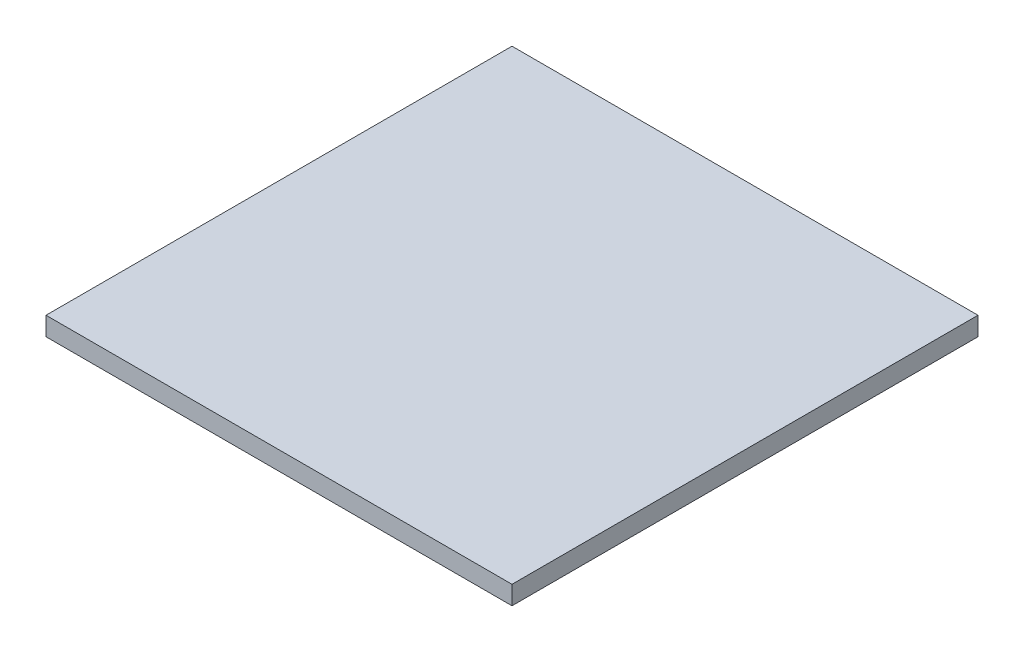
ISO-10303-21;
HEADER;
FILE_DESCRIPTION(('STEP AP214'),'2;1');
FILE_NAME('part.step','',(''),(''),'','','');
FILE_SCHEMA(('AUTOMOTIVE_DESIGN { 1 0 10303 214 1 1 1 1 }'));
ENDSEC;
DATA;
#1=APPLICATION_CONTEXT('core data for automotive mechanical design processes');
#2=APPLICATION_PROTOCOL_DEFINITION('international standard','automotive_design',2000,#1);
#3=PRODUCT_CONTEXT('',#1,'mechanical');
#4=PRODUCT('Part','Part','',(#3));
#5=PRODUCT_RELATED_PRODUCT_CATEGORY('part','',(#4));
#6=PRODUCT_DEFINITION_FORMATION('','',#4);
#7=PRODUCT_DEFINITION_CONTEXT('part definition',#1,'design');
#8=PRODUCT_DEFINITION('design','',#6,#7);
#9=PRODUCT_DEFINITION_SHAPE('','',#8);
#10=(LENGTH_UNIT() NAMED_UNIT(*) SI_UNIT(.MILLI.,.METRE.));
#11=(NAMED_UNIT(*) PLANE_ANGLE_UNIT() SI_UNIT($,.RADIAN.));
#12=(NAMED_UNIT(*) SI_UNIT($,.STERADIAN.) SOLID_ANGLE_UNIT());
#13=UNCERTAINTY_MEASURE_WITH_UNIT(LENGTH_MEASURE(1.E-05),#10,'distance_accuracy_value','');
#14=(GEOMETRIC_REPRESENTATION_CONTEXT(3) GLOBAL_UNCERTAINTY_ASSIGNED_CONTEXT((#13)) GLOBAL_UNIT_ASSIGNED_CONTEXT((#10,
#11,#12)) REPRESENTATION_CONTEXT('',''));
#15=CARTESIAN_POINT('',(0.,0.,0.));
#16=DIRECTION('',(0.,0.,1.));
#17=DIRECTION('',(1.,0.,0.));
#18=AXIS2_PLACEMENT_3D('',#15,#16,#17);
#19=CARTESIAN_POINT('',(-76.8315510886013,10.,-179.918824805765));
#20=DIRECTION('',(1.,0.,0.));
#21=DIRECTION('',(0.,0.,-1.));
#22=AXIS2_PLACEMENT_3D('',#19,#20,#21);
#23=PLANE('',#22);
#24=DIRECTION('',(0.,0.,1.));
#25=VECTOR('',#24,1.);
#26=CARTESIAN_POINT('',(-76.8315510886013,0.,-179.918824805765));
#27=LINE('',#26,#25);
#28=CARTESIAN_POINT('',(-76.8315510886013,0.,-179.918824805765));
#29=VERTEX_POINT('',#28);
#30=CARTESIAN_POINT('',(-76.8315510886012,0.,70.0811751942353));
#31=VERTEX_POINT('',#30);
#32=EDGE_CURVE('E96',#29,#31,#27,.T.);
#33=ORIENTED_EDGE('',*,*,#32,.T.);
#34=DIRECTION('',(0.,-1.,0.));
#35=VECTOR('',#34,1.);
#36=CARTESIAN_POINT('',(-76.8315510886012,10.,70.0811751942353));
#37=LINE('',#36,#35);
#38=CARTESIAN_POINT('',(-76.8315510886012,10.,70.0811751942353));
#39=VERTEX_POINT('',#38);
#40=EDGE_CURVE('E11',#39,#31,#37,.T.);
#41=ORIENTED_EDGE('',*,*,#40,.F.);
#42=DIRECTION('',(0.,0.,1.));
#43=VECTOR('',#42,1.);
#44=CARTESIAN_POINT('',(-76.8315510886013,10.,-179.918824805765));
#45=LINE('',#44,#43);
#46=CARTESIAN_POINT('',(-76.8315510886013,10.,-179.918824805765));
#47=VERTEX_POINT('',#46);
#48=EDGE_CURVE('E84',#47,#39,#45,.T.);
#49=ORIENTED_EDGE('',*,*,#48,.F.);
#50=DIRECTION('',(0.,-1.,0.));
#51=VECTOR('',#50,1.);
#52=CARTESIAN_POINT('',(-76.8315510886013,10.,-179.918824805765));
#53=LINE('',#52,#51);
#54=EDGE_CURVE('E92',#47,#29,#53,.T.);
#55=ORIENTED_EDGE('',*,*,#54,.T.);
#56=EDGE_LOOP('',(#33,#41,#49,#55));
#57=FACE_BOUND('',#56,.T.);
#58=ADVANCED_FACE('F33',(#57),#23,.F.);
#59=CARTESIAN_POINT('',(-76.8315510886012,10.,70.0811751942353));
#60=DIRECTION('',(0.,0.,-1.));
#61=DIRECTION('',(-1.,0.,0.));
#62=AXIS2_PLACEMENT_3D('',#59,#60,#61);
#63=PLANE('',#62);
#64=DIRECTION('',(1.,0.,0.));
#65=VECTOR('',#64,1.);
#66=CARTESIAN_POINT('',(-76.8315510886012,0.,70.0811751942353));
#67=LINE('',#66,#65);
#68=CARTESIAN_POINT('',(173.168448911399,0.,70.0811751942353));
#69=VERTEX_POINT('',#68);
#70=EDGE_CURVE('E88',#31,#69,#67,.T.);
#71=ORIENTED_EDGE('',*,*,#70,.T.);
#72=DIRECTION('',(0.,-1.,0.));
#73=VECTOR('',#72,1.);
#74=CARTESIAN_POINT('',(173.168448911399,10.,70.0811751942353));
#75=LINE('',#74,#73);
#76=CARTESIAN_POINT('',(173.168448911399,10.,70.0811751942353));
#77=VERTEX_POINT('',#76);
#78=EDGE_CURVE('E41',#77,#69,#75,.T.);
#79=ORIENTED_EDGE('',*,*,#78,.F.);
#80=DIRECTION('',(1.,0.,0.));
#81=VECTOR('',#80,1.);
#82=CARTESIAN_POINT('',(-76.8315510886012,10.,70.0811751942353));
#83=LINE('',#82,#81);
#84=EDGE_CURVE('E79',#39,#77,#83,.T.);
#85=ORIENTED_EDGE('',*,*,#84,.F.);
#86=ORIENTED_EDGE('',*,*,#40,.T.);
#87=EDGE_LOOP('',(#71,#79,#85,#86));
#88=FACE_BOUND('',#87,.T.);
#89=ADVANCED_FACE('F87',(#88),#63,.F.);
#90=CARTESIAN_POINT('',(173.168448911399,10.,-179.918824805765));
#91=DIRECTION('',(-1.,0.,0.));
#92=DIRECTION('',(0.,0.,1.));
#93=AXIS2_PLACEMENT_3D('',#90,#91,#92);
#94=PLANE('',#93);
#95=DIRECTION('',(0.,0.,-1.));
#96=VECTOR('',#95,1.);
#97=CARTESIAN_POINT('',(173.168448911399,0.,-179.918824805765));
#98=LINE('',#97,#96);
#99=CARTESIAN_POINT('',(173.168448911399,0.,-179.918824805765));
#100=VERTEX_POINT('',#99);
#101=EDGE_CURVE('E66',#69,#100,#98,.T.);
#102=ORIENTED_EDGE('',*,*,#101,.T.);
#103=DIRECTION('',(0.,-1.,0.));
#104=VECTOR('',#103,1.);
#105=CARTESIAN_POINT('',(173.168448911399,10.,-179.918824805765));
#106=LINE('',#105,#104);
#107=CARTESIAN_POINT('',(173.168448911399,10.,-179.918824805765));
#108=VERTEX_POINT('',#107);
#109=EDGE_CURVE('E89',#108,#100,#106,.T.);
#110=ORIENTED_EDGE('',*,*,#109,.F.);
#111=DIRECTION('',(0.,0.,-1.));
#112=VECTOR('',#111,1.);
#113=CARTESIAN_POINT('',(173.168448911399,10.,-179.918824805765));
#114=LINE('',#113,#112);
#115=EDGE_CURVE('E82',#77,#108,#114,.T.);
#116=ORIENTED_EDGE('',*,*,#115,.F.);
#117=ORIENTED_EDGE('',*,*,#78,.T.);
#118=EDGE_LOOP('',(#102,#110,#116,#117));
#119=FACE_BOUND('',#118,.T.);
#120=ADVANCED_FACE('F90',(#119),#94,.F.);
#121=CARTESIAN_POINT('',(-76.8315510886013,10.,-179.918824805765));
#122=DIRECTION('',(0.,0.,1.));
#123=DIRECTION('',(1.,0.,0.));
#124=AXIS2_PLACEMENT_3D('',#121,#122,#123);
#125=PLANE('',#124);
#126=DIRECTION('',(-1.,0.,0.));
#127=VECTOR('',#126,1.);
#128=CARTESIAN_POINT('',(-76.8315510886013,0.,-179.918824805765));
#129=LINE('',#128,#127);
#130=EDGE_CURVE('E72',#100,#29,#129,.T.);
#131=ORIENTED_EDGE('',*,*,#130,.T.);
#132=ORIENTED_EDGE('',*,*,#54,.F.);
#133=DIRECTION('',(-1.,0.,0.));
#134=VECTOR('',#133,1.);
#135=CARTESIAN_POINT('',(-76.8315510886013,10.,-179.918824805765));
#136=LINE('',#135,#134);
#137=EDGE_CURVE('E49',#108,#47,#136,.T.);
#138=ORIENTED_EDGE('',*,*,#137,.F.);
#139=ORIENTED_EDGE('',*,*,#109,.T.);
#140=EDGE_LOOP('',(#131,#132,#138,#139));
#141=FACE_BOUND('',#140,.T.);
#142=ADVANCED_FACE('F103',(#141),#125,.F.);
#143=CARTESIAN_POINT('',(0.,10.,0.));
#144=DIRECTION('',(0.,1.,0.));
#145=DIRECTION('',(0.,0.,1.));
#146=AXIS2_PLACEMENT_3D('',#143,#144,#145);
#147=PLANE('',#146);
#148=ORIENTED_EDGE('',*,*,#48,.T.);
#149=ORIENTED_EDGE('',*,*,#84,.T.);
#150=ORIENTED_EDGE('',*,*,#115,.T.);
#151=ORIENTED_EDGE('',*,*,#137,.T.);
#152=EDGE_LOOP('',(#148,#149,#150,#151));
#153=FACE_BOUND('',#152,.T.);
#154=ADVANCED_FACE('F80',(#153),#147,.T.);
#155=CARTESIAN_POINT('',(0.,0.,0.));
#156=DIRECTION('',(0.,1.,0.));
#157=DIRECTION('',(0.,0.,1.));
#158=AXIS2_PLACEMENT_3D('',#155,#156,#157);
#159=PLANE('',#158);
#160=ORIENTED_EDGE('',*,*,#32,.F.);
#161=ORIENTED_EDGE('',*,*,#130,.F.);
#162=ORIENTED_EDGE('',*,*,#101,.F.);
#163=ORIENTED_EDGE('',*,*,#70,.F.);
#164=EDGE_LOOP('',(#160,#161,#162,#163));
#165=FACE_BOUND('',#164,.T.);
#166=ADVANCED_FACE('F106',(#165),#159,.F.);
#167=CLOSED_SHELL('',(#58,#89,#120,#142,#154,#166));
#168=MANIFOLD_SOLID_BREP('B2',#167);
#169=ADVANCED_BREP_SHAPE_REPRESENTATION('',(#18,#168),#14);
#170=SHAPE_DEFINITION_REPRESENTATION(#9,#169);
ENDSEC;
END-ISO-10303-21;
